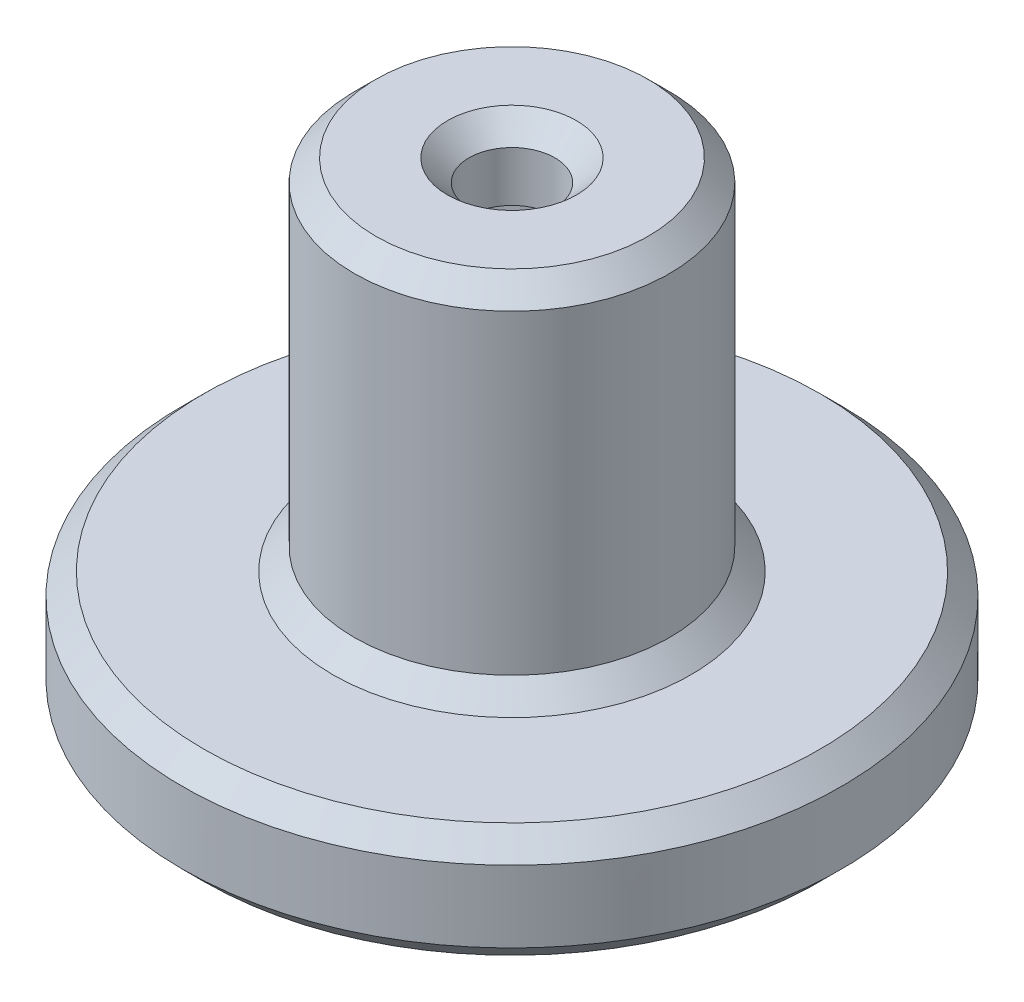
ISO-10303-21;
HEADER;
FILE_DESCRIPTION(('STEP AP214'),'2;1');
FILE_NAME('part.step','',(''),(''),'','','');
FILE_SCHEMA(('AUTOMOTIVE_DESIGN { 1 0 10303 214 1 1 1 1 }'));
ENDSEC;
DATA;
#1=APPLICATION_CONTEXT('core data for automotive mechanical design processes');
#2=APPLICATION_PROTOCOL_DEFINITION('international standard','automotive_design',2000,#1);
#3=PRODUCT_CONTEXT('',#1,'mechanical');
#4=PRODUCT('Part','Part','',(#3));
#5=PRODUCT_RELATED_PRODUCT_CATEGORY('part','',(#4));
#6=PRODUCT_DEFINITION_FORMATION('','',#4);
#7=PRODUCT_DEFINITION_CONTEXT('part definition',#1,'design');
#8=PRODUCT_DEFINITION('design','',#6,#7);
#9=PRODUCT_DEFINITION_SHAPE('','',#8);
#10=(LENGTH_UNIT() NAMED_UNIT(*) SI_UNIT(.MILLI.,.METRE.));
#11=(NAMED_UNIT(*) PLANE_ANGLE_UNIT() SI_UNIT($,.RADIAN.));
#12=(NAMED_UNIT(*) SI_UNIT($,.STERADIAN.) SOLID_ANGLE_UNIT());
#13=UNCERTAINTY_MEASURE_WITH_UNIT(LENGTH_MEASURE(1.E-05),#10,'distance_accuracy_value','');
#14=(GEOMETRIC_REPRESENTATION_CONTEXT(3) GLOBAL_UNCERTAINTY_ASSIGNED_CONTEXT((#13)) GLOBAL_UNIT_ASSIGNED_CONTEXT((#10,
#11,#12)) REPRESENTATION_CONTEXT('',''));
#15=CARTESIAN_POINT('',(0.,0.,0.));
#16=DIRECTION('',(0.,0.,1.));
#17=DIRECTION('',(1.,0.,0.));
#18=AXIS2_PLACEMENT_3D('',#15,#16,#17);
#19=CARTESIAN_POINT('',(0.,8.,0.));
#20=DIRECTION('',(0.,1.,0.));
#21=DIRECTION('',(0.,0.,1.));
#22=AXIS2_PLACEMENT_3D('',#19,#20,#21);
#23=PLANE('',#22);
#24=CARTESIAN_POINT('',(0.,8.,3.95));
#25=DIRECTION('',(0.,1.,0.));
#26=DIRECTION('',(0.,0.,1.));
#27=AXIS2_PLACEMENT_3D('',#24,#25,#26);
#28=CIRCLE('',#27,21.5);
#29=CARTESIAN_POINT('',(0.,8.,-17.55));
#30=VERTEX_POINT('',#29);
#31=EDGE_CURVE('E348',#30,#30,#28,.T.);
#32=ORIENTED_EDGE('',*,*,#31,.T.);
#33=EDGE_LOOP('',(#32));
#34=FACE_BOUND('',#33,.T.);
#35=CARTESIAN_POINT('',(0.,8.,3.95));
#36=DIRECTION('',(0.,1.,0.));
#37=DIRECTION('',(0.,0.,1.));
#38=AXIS2_PLACEMENT_3D('',#35,#36,#37);
#39=CIRCLE('',#38,12.5);
#40=CARTESIAN_POINT('',(0.,8.,16.45));
#41=VERTEX_POINT('',#40);
#42=EDGE_CURVE('E345',#41,#41,#39,.F.);
#43=ORIENTED_EDGE('',*,*,#42,.T.);
#44=EDGE_LOOP('',(#43));
#45=FACE_BOUND('',#44,.T.);
#46=ADVANCED_FACE('F62',(#34,#45),#23,.T.);
#47=CARTESIAN_POINT('',(1.11459982752573,8.,-1.93054353138208));
#48=DIRECTION('',(-0.5,0.,0.866025403784439));
#49=DIRECTION('',(0.866025403784439,0.,0.5));
#50=AXIS2_PLACEMENT_3D('',#47,#48,#49);
#51=PLANE('',#50);
#52=DIRECTION('',(0.,-1.,0.));
#53=VECTOR('',#52,1.);
#54=CARTESIAN_POINT('',(0.,8.,-2.57405804184277));
#55=LINE('',#54,#53);
#56=CARTESIAN_POINT('',(0.,28.,-2.57405804184277));
#57=VERTEX_POINT('',#56);
#58=CARTESIAN_POINT('',(0.,1.50000000000001,-2.57405804184277));
#59=VERTEX_POINT('',#58);
#60=EDGE_CURVE('E265',#57,#59,#55,.T.);
#61=ORIENTED_EDGE('',*,*,#60,.T.);
#62=DIRECTION('',(0.866025403784439,0.,0.5));
#63=VECTOR('',#62,1.);
#64=CARTESIAN_POINT('',(5.65,1.50000000000001,0.687970979078613));
#65=LINE('',#64,#63);
#66=CARTESIAN_POINT('',(5.65,1.50000000000001,0.687970979078613));
#67=VERTEX_POINT('',#66);
#68=EDGE_CURVE('E337',#59,#67,#65,.T.);
#69=ORIENTED_EDGE('',*,*,#68,.T.);
#70=DIRECTION('',(0.,-1.,0.));
#71=VECTOR('',#70,1.);
#72=CARTESIAN_POINT('',(5.65,8.,0.687970979078613));
#73=LINE('',#72,#71);
#74=CARTESIAN_POINT('',(5.65,28.,0.687970979078614));
#75=VERTEX_POINT('',#74);
#76=EDGE_CURVE('E295',#75,#67,#73,.T.);
#77=ORIENTED_EDGE('',*,*,#76,.F.);
#78=DIRECTION('',(0.866025403784439,0.,0.5));
#79=VECTOR('',#78,1.);
#80=CARTESIAN_POINT('',(1.11459982752573,28.,-1.93054353138208));
#81=LINE('',#80,#79);
#82=EDGE_CURVE('E830',#57,#75,#81,.T.);
#83=ORIENTED_EDGE('',*,*,#82,.F.);
#84=EDGE_LOOP('',(#61,#69,#77,#83));
#85=FACE_BOUND('',#84,.T.);
#86=ADVANCED_FACE('F408',(#85),#51,.T.);
#87=CARTESIAN_POINT('',(5.65,8.,0.));
#88=DIRECTION('',(-1.,0.,0.));
#89=DIRECTION('',(0.,0.,1.));
#90=AXIS2_PLACEMENT_3D('',#87,#88,#89);
#91=PLANE('',#90);
#92=DIRECTION('',(0.,-1.,0.));
#93=VECTOR('',#92,1.);
#94=CARTESIAN_POINT('',(5.65,3.5,5.2));
#95=LINE('',#94,#93);
#96=CARTESIAN_POINT('',(5.65,3.5,5.2));
#97=VERTEX_POINT('',#96);
#98=CARTESIAN_POINT('',(5.65,1.50000000000001,5.2));
#99=VERTEX_POINT('',#98);
#100=EDGE_CURVE('E276',#97,#99,#95,.T.);
#101=ORIENTED_EDGE('',*,*,#100,.T.);
#102=DIRECTION('',(0.,0.,1.));
#103=VECTOR('',#102,1.);
#104=CARTESIAN_POINT('',(5.65,1.50000000000001,7.21202902092138));
#105=LINE('',#104,#103);
#106=CARTESIAN_POINT('',(5.65,1.50000000000001,7.21202902092138));
#107=VERTEX_POINT('',#106);
#108=EDGE_CURVE('E330',#99,#107,#105,.T.);
#109=ORIENTED_EDGE('',*,*,#108,.T.);
#110=DIRECTION('',(0.,-1.,0.));
#111=VECTOR('',#110,1.);
#112=CARTESIAN_POINT('',(5.65,8.,7.21202902092138));
#113=LINE('',#112,#111);
#114=CARTESIAN_POINT('',(5.65,28.,7.21202902092138));
#115=VERTEX_POINT('',#114);
#116=EDGE_CURVE('E292',#115,#107,#113,.T.);
#117=ORIENTED_EDGE('',*,*,#116,.F.);
#118=DIRECTION('',(0.,0.,1.));
#119=VECTOR('',#118,1.);
#120=CARTESIAN_POINT('',(5.65,28.,0.));
#121=LINE('',#120,#119);
#122=EDGE_CURVE('E230',#75,#115,#121,.T.);
#123=ORIENTED_EDGE('',*,*,#122,.F.);
#124=ORIENTED_EDGE('',*,*,#76,.T.);
#125=DIRECTION('',(0.,0.,1.));
#126=VECTOR('',#125,1.);
#127=CARTESIAN_POINT('',(5.65,1.50000000000001,2.7));
#128=LINE('',#127,#126);
#129=CARTESIAN_POINT('',(5.65,1.50000000000001,2.7));
#130=VERTEX_POINT('',#129);
#131=EDGE_CURVE('E87',#67,#130,#128,.T.);
#132=ORIENTED_EDGE('',*,*,#131,.T.);
#133=DIRECTION('',(0.,-1.,0.));
#134=VECTOR('',#133,1.);
#135=CARTESIAN_POINT('',(5.65,3.5,2.7));
#136=LINE('',#135,#134);
#137=CARTESIAN_POINT('',(5.65,3.5,2.7));
#138=VERTEX_POINT('',#137);
#139=EDGE_CURVE('E284',#138,#130,#136,.T.);
#140=ORIENTED_EDGE('',*,*,#139,.F.);
#141=DIRECTION('',(0.,0.,-1.));
#142=VECTOR('',#141,1.);
#143=CARTESIAN_POINT('',(5.65,3.5,0.));
#144=LINE('',#143,#142);
#145=EDGE_CURVE('E274',#97,#138,#144,.T.);
#146=ORIENTED_EDGE('',*,*,#145,.F.);
#147=EDGE_LOOP('',(#101,#109,#117,#123,#124,#132,#140,#146));
#148=FACE_BOUND('',#147,.T.);
#149=ADVANCED_FACE('F404',(#148),#91,.T.);
#150=CARTESIAN_POINT('',(4.53540017247427,8.,7.85554353138208));
#151=DIRECTION('',(-0.5,0.,-0.866025403784438));
#152=DIRECTION('',(-0.866025403784438,0.,0.5));
#153=AXIS2_PLACEMENT_3D('',#150,#151,#152);
#154=PLANE('',#153);
#155=ORIENTED_EDGE('',*,*,#116,.T.);
#156=DIRECTION('',(-0.866025403784438,0.,0.5));
#157=VECTOR('',#156,1.);
#158=CARTESIAN_POINT('',(0.,1.50000000000001,10.4740580418428));
#159=LINE('',#158,#157);
#160=CARTESIAN_POINT('',(0.,1.50000000000001,10.4740580418428));
#161=VERTEX_POINT('',#160);
#162=EDGE_CURVE('E325',#107,#161,#159,.T.);
#163=ORIENTED_EDGE('',*,*,#162,.T.);
#164=DIRECTION('',(0.,-1.,0.));
#165=VECTOR('',#164,1.);
#166=CARTESIAN_POINT('',(0.,8.,10.4740580418428));
#167=LINE('',#166,#165);
#168=CARTESIAN_POINT('',(0.,28.,10.4740580418428));
#169=VERTEX_POINT('',#168);
#170=EDGE_CURVE('E219',#169,#161,#167,.T.);
#171=ORIENTED_EDGE('',*,*,#170,.F.);
#172=DIRECTION('',(-0.866025403784439,0.,0.5));
#173=VECTOR('',#172,1.);
#174=CARTESIAN_POINT('',(4.53540017247427,28.,7.85554353138208));
#175=LINE('',#174,#173);
#176=EDGE_CURVE('E224',#115,#169,#175,.T.);
#177=ORIENTED_EDGE('',*,*,#176,.F.);
#178=EDGE_LOOP('',(#155,#163,#171,#177));
#179=FACE_BOUND('',#178,.T.);
#180=ADVANCED_FACE('F407',(#179),#154,.T.);
#181=CARTESIAN_POINT('',(-4.53540017247426,8.,7.85554353138208));
#182=DIRECTION('',(0.5,0.,-0.866025403784439));
#183=DIRECTION('',(-0.866025403784439,0.,-0.5));
#184=AXIS2_PLACEMENT_3D('',#181,#182,#183);
#185=PLANE('',#184);
#186=ORIENTED_EDGE('',*,*,#170,.T.);
#187=DIRECTION('',(-0.866025403784439,0.,-0.5));
#188=VECTOR('',#187,1.);
#189=CARTESIAN_POINT('',(-5.65,1.50000000000001,7.21202902092138));
#190=LINE('',#189,#188);
#191=CARTESIAN_POINT('',(-5.65,1.50000000000001,7.21202902092138));
#192=VERTEX_POINT('',#191);
#193=EDGE_CURVE('E218',#161,#192,#190,.T.);
#194=ORIENTED_EDGE('',*,*,#193,.T.);
#195=DIRECTION('',(0.,-1.,0.));
#196=VECTOR('',#195,1.);
#197=CARTESIAN_POINT('',(-5.65,8.,7.21202902092138));
#198=LINE('',#197,#196);
#199=CARTESIAN_POINT('',(-5.65,28.,7.21202902092138));
#200=VERTEX_POINT('',#199);
#201=EDGE_CURVE('E201',#200,#192,#198,.T.);
#202=ORIENTED_EDGE('',*,*,#201,.F.);
#203=DIRECTION('',(-0.866025403784439,0.,-0.5));
#204=VECTOR('',#203,1.);
#205=CARTESIAN_POINT('',(-4.53540017247427,28.,7.85554353138208));
#206=LINE('',#205,#204);
#207=EDGE_CURVE('E215',#169,#200,#206,.T.);
#208=ORIENTED_EDGE('',*,*,#207,.F.);
#209=EDGE_LOOP('',(#186,#194,#202,#208));
#210=FACE_BOUND('',#209,.T.);
#211=ADVANCED_FACE('F214',(#210),#185,.T.);
#212=CARTESIAN_POINT('',(-5.65,8.,0.));
#213=DIRECTION('',(1.,0.,0.));
#214=DIRECTION('',(0.,0.,-1.));
#215=AXIS2_PLACEMENT_3D('',#212,#213,#214);
#216=PLANE('',#215);
#217=ORIENTED_EDGE('',*,*,#201,.T.);
#218=DIRECTION('',(0.,0.,-1.));
#219=VECTOR('',#218,1.);
#220=CARTESIAN_POINT('',(-5.65,1.50000000000001,5.2));
#221=LINE('',#220,#219);
#222=CARTESIAN_POINT('',(-5.65,1.50000000000001,5.2));
#223=VERTEX_POINT('',#222);
#224=EDGE_CURVE('E320',#192,#223,#221,.T.);
#225=ORIENTED_EDGE('',*,*,#224,.T.);
#226=DIRECTION('',(0.,-1.,0.));
#227=VECTOR('',#226,1.);
#228=CARTESIAN_POINT('',(-5.65,3.5,5.2));
#229=LINE('',#228,#227);
#230=CARTESIAN_POINT('',(-5.65,3.5,5.2));
#231=VERTEX_POINT('',#230);
#232=EDGE_CURVE('E262',#231,#223,#229,.T.);
#233=ORIENTED_EDGE('',*,*,#232,.F.);
#234=DIRECTION('',(0.,0.,1.));
#235=VECTOR('',#234,1.);
#236=CARTESIAN_POINT('',(-5.65,3.5,0.));
#237=LINE('',#236,#235);
#238=CARTESIAN_POINT('',(-5.65,3.5,2.7));
#239=VERTEX_POINT('',#238);
#240=EDGE_CURVE('E237',#239,#231,#237,.T.);
#241=ORIENTED_EDGE('',*,*,#240,.F.);
#242=DIRECTION('',(0.,-1.,0.));
#243=VECTOR('',#242,1.);
#244=CARTESIAN_POINT('',(-5.65,3.5,2.7));
#245=LINE('',#244,#243);
#246=CARTESIAN_POINT('',(-5.65,1.50000000000001,2.7));
#247=VERTEX_POINT('',#246);
#248=EDGE_CURVE('E259',#239,#247,#245,.T.);
#249=ORIENTED_EDGE('',*,*,#248,.T.);
#250=DIRECTION('',(0.,0.,-1.));
#251=VECTOR('',#250,1.);
#252=CARTESIAN_POINT('',(-5.65,1.50000000000001,0.687970979078614));
#253=LINE('',#252,#251);
#254=CARTESIAN_POINT('',(-5.65,1.50000000000001,0.687970979078614));
#255=VERTEX_POINT('',#254);
#256=EDGE_CURVE('E318',#247,#255,#253,.T.);
#257=ORIENTED_EDGE('',*,*,#256,.T.);
#258=DIRECTION('',(0.,-1.,0.));
#259=VECTOR('',#258,1.);
#260=CARTESIAN_POINT('',(-5.65,8.,0.687970979078614));
#261=LINE('',#260,#259);
#262=CARTESIAN_POINT('',(-5.65,28.,0.687970979078615));
#263=VERTEX_POINT('',#262);
#264=EDGE_CURVE('E203',#263,#255,#261,.T.);
#265=ORIENTED_EDGE('',*,*,#264,.F.);
#266=DIRECTION('',(0.,0.,-1.));
#267=VECTOR('',#266,1.);
#268=CARTESIAN_POINT('',(-5.65,28.,0.));
#269=LINE('',#268,#267);
#270=EDGE_CURVE('E198',#200,#263,#269,.T.);
#271=ORIENTED_EDGE('',*,*,#270,.F.);
#272=EDGE_LOOP('',(#217,#225,#233,#241,#249,#257,#265,#271));
#273=FACE_BOUND('',#272,.T.);
#274=ADVANCED_FACE('F200',(#273),#216,.T.);
#275=CARTESIAN_POINT('',(-1.11459982752573,8.,-1.93054353138208));
#276=DIRECTION('',(0.5,0.,0.866025403784439));
#277=DIRECTION('',(0.866025403784439,0.,-0.5));
#278=AXIS2_PLACEMENT_3D('',#275,#276,#277);
#279=PLANE('',#278);
#280=ORIENTED_EDGE('',*,*,#264,.T.);
#281=DIRECTION('',(0.866025403784439,0.,-0.5));
#282=VECTOR('',#281,1.);
#283=CARTESIAN_POINT('',(0.,1.50000000000001,-2.57405804184277));
#284=LINE('',#283,#282);
#285=EDGE_CURVE('E79',#255,#59,#284,.T.);
#286=ORIENTED_EDGE('',*,*,#285,.T.);
#287=ORIENTED_EDGE('',*,*,#60,.F.);
#288=DIRECTION('',(0.866025403784439,0.,-0.5));
#289=VECTOR('',#288,1.);
#290=CARTESIAN_POINT('',(-1.11459982752573,28.,-1.93054353138208));
#291=LINE('',#290,#289);
#292=EDGE_CURVE('E208',#263,#57,#291,.T.);
#293=ORIENTED_EDGE('',*,*,#292,.F.);
#294=EDGE_LOOP('',(#280,#286,#287,#293));
#295=FACE_BOUND('',#294,.T.);
#296=ADVANCED_FACE('F434',(#295),#279,.T.);
#297=CARTESIAN_POINT('',(0.,8.,3.95));
#298=DIRECTION('',(0.,-1.,0.));
#299=DIRECTION('',(0.,0.,-1.));
#300=AXIS2_PLACEMENT_3D('',#297,#298,#299);
#301=CYLINDRICAL_SURFACE('',#300,23.);
#302=CARTESIAN_POINT('',(0.,1.5,3.95));
#303=DIRECTION('',(0.,1.,0.));
#304=DIRECTION('',(0.,0.,1.));
#305=AXIS2_PLACEMENT_3D('',#302,#303,#304);
#306=CIRCLE('',#305,23.);
#307=CARTESIAN_POINT('',(0.,1.5,26.95));
#308=VERTEX_POINT('',#307);
#309=EDGE_CURVE('E342',#308,#308,#306,.T.);
#310=ORIENTED_EDGE('',*,*,#309,.T.);
#311=EDGE_LOOP('',(#310));
#312=FACE_BOUND('',#311,.T.);
#313=CARTESIAN_POINT('',(0.,6.49999999999999,3.95));
#314=DIRECTION('',(0.,1.,0.));
#315=DIRECTION('',(0.,0.,1.));
#316=AXIS2_PLACEMENT_3D('',#313,#314,#315);
#317=CIRCLE('',#316,23.);
#318=CARTESIAN_POINT('',(0.,6.49999999999999,-19.05));
#319=VERTEX_POINT('',#318);
#320=EDGE_CURVE('E339',#319,#319,#317,.F.);
#321=ORIENTED_EDGE('',*,*,#320,.T.);
#322=EDGE_LOOP('',(#321));
#323=FACE_BOUND('',#322,.T.);
#324=ADVANCED_FACE('F430',(#312,#323),#301,.T.);
#325=CARTESIAN_POINT('',(0.,0.,0.));
#326=DIRECTION('',(0.,1.,0.));
#327=DIRECTION('',(0.,0.,1.));
#328=AXIS2_PLACEMENT_3D('',#325,#326,#327);
#329=PLANE('',#328);
#330=CARTESIAN_POINT('',(0.,0.,3.95));
#331=DIRECTION('',(0.,1.,0.));
#332=DIRECTION('',(0.,0.,1.));
#333=AXIS2_PLACEMENT_3D('',#330,#331,#332);
#334=CIRCLE('',#333,21.5);
#335=CARTESIAN_POINT('',(0.,0.,25.45));
#336=VERTEX_POINT('',#335);
#337=EDGE_CURVE('E297',#336,#336,#334,.F.);
#338=ORIENTED_EDGE('',*,*,#337,.T.);
#339=EDGE_LOOP('',(#338));
#340=FACE_BOUND('',#339,.T.);
#341=DIRECTION('',(-1.,0.,0.));
#342=VECTOR('',#341,1.);
#343=CARTESIAN_POINT('',(0.,0.,5.2));
#344=LINE('',#343,#342);
#345=CARTESIAN_POINT('',(-7.15,0.,5.2));
#346=VERTEX_POINT('',#345);
#347=CARTESIAN_POINT('',(-17.5,0.,5.2));
#348=VERTEX_POINT('',#347);
#349=EDGE_CURVE('E247',#346,#348,#344,.T.);
#350=ORIENTED_EDGE('',*,*,#349,.F.);
#351=DIRECTION('',(0.,0.,1.));
#352=VECTOR('',#351,1.);
#353=CARTESIAN_POINT('',(-7.15,0.,7.21202902092138));
#354=LINE('',#353,#352);
#355=CARTESIAN_POINT('',(-7.15,0.,8.07805442470582));
#356=VERTEX_POINT('',#355);
#357=EDGE_CURVE('E315',#346,#356,#354,.T.);
#358=ORIENTED_EDGE('',*,*,#357,.T.);
#359=DIRECTION('',(0.866025403784439,0.,0.5));
#360=VECTOR('',#359,1.);
#361=CARTESIAN_POINT('',(-0.749999999999998,0.,11.7730961475194));
#362=LINE('',#361,#360);
#363=CARTESIAN_POINT('',(0.,0.,12.2061088494117));
#364=VERTEX_POINT('',#363);
#365=EDGE_CURVE('E313',#356,#364,#362,.T.);
#366=ORIENTED_EDGE('',*,*,#365,.T.);
#367=DIRECTION('',(0.866025403784439,0.,-0.5));
#368=VECTOR('',#367,1.);
#369=CARTESIAN_POINT('',(6.4,0.,8.51106712659804));
#370=LINE('',#369,#368);
#371=CARTESIAN_POINT('',(7.15,0.,8.07805442470582));
#372=VERTEX_POINT('',#371);
#373=EDGE_CURVE('E311',#364,#372,#370,.T.);
#374=ORIENTED_EDGE('',*,*,#373,.T.);
#375=DIRECTION('',(0.,0.,-1.));
#376=VECTOR('',#375,1.);
#377=CARTESIAN_POINT('',(7.15,0.,5.2));
#378=LINE('',#377,#376);
#379=CARTESIAN_POINT('',(7.15,0.,5.2));
#380=VERTEX_POINT('',#379);
#381=EDGE_CURVE('E309',#372,#380,#378,.T.);
#382=ORIENTED_EDGE('',*,*,#381,.T.);
#383=DIRECTION('',(-1.,0.,0.));
#384=VECTOR('',#383,1.);
#385=CARTESIAN_POINT('',(0.,0.,5.2));
#386=LINE('',#385,#384);
#387=CARTESIAN_POINT('',(17.5,0.,5.2));
#388=VERTEX_POINT('',#387);
#389=EDGE_CURVE('E225',#388,#380,#386,.T.);
#390=ORIENTED_EDGE('',*,*,#389,.F.);
#391=DIRECTION('',(0.,0.,-1.));
#392=VECTOR('',#391,1.);
#393=CARTESIAN_POINT('',(17.5,0.,0.));
#394=LINE('',#393,#392);
#395=CARTESIAN_POINT('',(17.5,0.,2.7));
#396=VERTEX_POINT('',#395);
#397=EDGE_CURVE('E228',#388,#396,#394,.T.);
#398=ORIENTED_EDGE('',*,*,#397,.T.);
#399=DIRECTION('',(-1.,0.,0.));
#400=VECTOR('',#399,1.);
#401=CARTESIAN_POINT('',(0.,0.,2.7));
#402=LINE('',#401,#400);
#403=CARTESIAN_POINT('',(7.15,0.,2.7));
#404=VERTEX_POINT('',#403);
#405=EDGE_CURVE('E270',#396,#404,#402,.T.);
#406=ORIENTED_EDGE('',*,*,#405,.T.);
#407=DIRECTION('',(0.,0.,-1.));
#408=VECTOR('',#407,1.);
#409=CARTESIAN_POINT('',(7.15,0.,0.687970979078613));
#410=LINE('',#409,#408);
#411=CARTESIAN_POINT('',(7.15,0.,-0.178054424705827));
#412=VERTEX_POINT('',#411);
#413=EDGE_CURVE('E304',#404,#412,#410,.T.);
#414=ORIENTED_EDGE('',*,*,#413,.T.);
#415=DIRECTION('',(-0.866025403784439,0.,-0.5));
#416=VECTOR('',#415,1.);
#417=CARTESIAN_POINT('',(0.75,0.,-3.87309614751943));
#418=LINE('',#417,#416);
#419=CARTESIAN_POINT('',(0.,0.,-4.30610884941165));
#420=VERTEX_POINT('',#419);
#421=EDGE_CURVE('E300',#412,#420,#418,.T.);
#422=ORIENTED_EDGE('',*,*,#421,.T.);
#423=DIRECTION('',(-0.866025403784439,0.,0.5));
#424=VECTOR('',#423,1.);
#425=CARTESIAN_POINT('',(-6.4,0.,-0.611067126598043));
#426=LINE('',#425,#424);
#427=CARTESIAN_POINT('',(-7.15,0.,-0.178054424705824));
#428=VERTEX_POINT('',#427);
#429=EDGE_CURVE('E302',#420,#428,#426,.T.);
#430=ORIENTED_EDGE('',*,*,#429,.T.);
#431=DIRECTION('',(0.,0.,1.));
#432=VECTOR('',#431,1.);
#433=CARTESIAN_POINT('',(-7.15,0.,2.7));
#434=LINE('',#433,#432);
#435=CARTESIAN_POINT('',(-7.15,0.,2.7));
#436=VERTEX_POINT('',#435);
#437=EDGE_CURVE('E306',#428,#436,#434,.T.);
#438=ORIENTED_EDGE('',*,*,#437,.T.);
#439=DIRECTION('',(-1.,0.,0.));
#440=VECTOR('',#439,1.);
#441=CARTESIAN_POINT('',(0.,0.,2.7));
#442=LINE('',#441,#440);
#443=CARTESIAN_POINT('',(-17.5,0.,2.7));
#444=VERTEX_POINT('',#443);
#445=EDGE_CURVE('E249',#436,#444,#442,.T.);
#446=ORIENTED_EDGE('',*,*,#445,.T.);
#447=DIRECTION('',(0.,0.,-1.));
#448=VECTOR('',#447,1.);
#449=CARTESIAN_POINT('',(-17.5,0.,0.));
#450=LINE('',#449,#448);
#451=EDGE_CURVE('E238',#348,#444,#450,.T.);
#452=ORIENTED_EDGE('',*,*,#451,.F.);
#453=EDGE_LOOP('',(#350,#358,#366,#374,#382,#390,#398,#406,#414,#422,#430,#438,#446,#452));
#454=FACE_BOUND('',#453,.T.);
#455=ADVANCED_FACE('F393',(#340,#454),#329,.F.);
#456=CARTESIAN_POINT('',(0.,3.5,5.2));
#457=DIRECTION('',(0.,0.,1.));
#458=DIRECTION('',(1.,0.,0.));
#459=AXIS2_PLACEMENT_3D('',#456,#457,#458);
#460=PLANE('',#459);
#461=ORIENTED_EDGE('',*,*,#389,.T.);
#462=DIRECTION('',(-0.707106781186546,0.707106781186549,0.));
#463=VECTOR('',#462,1.);
#464=CARTESIAN_POINT('',(7.15,0.,5.2));
#465=LINE('',#464,#463);
#466=EDGE_CURVE('E327',#380,#99,#465,.T.);
#467=ORIENTED_EDGE('',*,*,#466,.T.);
#468=ORIENTED_EDGE('',*,*,#100,.F.);
#469=DIRECTION('',(-1.,0.,0.));
#470=VECTOR('',#469,1.);
#471=CARTESIAN_POINT('',(0.,3.5,5.2));
#472=LINE('',#471,#470);
#473=CARTESIAN_POINT('',(17.5,3.5,5.2));
#474=VERTEX_POINT('',#473);
#475=EDGE_CURVE('E266',#474,#97,#472,.T.);
#476=ORIENTED_EDGE('',*,*,#475,.F.);
#477=DIRECTION('',(0.,-1.,0.));
#478=VECTOR('',#477,1.);
#479=CARTESIAN_POINT('',(17.5,3.5,5.2));
#480=LINE('',#479,#478);
#481=EDGE_CURVE('E250',#474,#388,#480,.T.);
#482=ORIENTED_EDGE('',*,*,#481,.T.);
#483=EDGE_LOOP('',(#461,#467,#468,#476,#482));
#484=FACE_BOUND('',#483,.T.);
#485=ADVANCED_FACE('F426',(#484),#460,.F.);
#486=CARTESIAN_POINT('',(17.5,3.5,0.));
#487=DIRECTION('',(-1.,0.,0.));
#488=DIRECTION('',(0.,0.,1.));
#489=AXIS2_PLACEMENT_3D('',#486,#487,#488);
#490=PLANE('',#489);
#491=ORIENTED_EDGE('',*,*,#397,.F.);
#492=ORIENTED_EDGE('',*,*,#481,.F.);
#493=DIRECTION('',(0.,0.,-1.));
#494=VECTOR('',#493,1.);
#495=CARTESIAN_POINT('',(17.5,3.5,0.));
#496=LINE('',#495,#494);
#497=CARTESIAN_POINT('',(17.5,3.5,2.7));
#498=VERTEX_POINT('',#497);
#499=EDGE_CURVE('E269',#474,#498,#496,.T.);
#500=ORIENTED_EDGE('',*,*,#499,.T.);
#501=DIRECTION('',(0.,-1.,0.));
#502=VECTOR('',#501,1.);
#503=CARTESIAN_POINT('',(17.5,3.5,2.7));
#504=LINE('',#503,#502);
#505=EDGE_CURVE('E286',#498,#396,#504,.T.);
#506=ORIENTED_EDGE('',*,*,#505,.T.);
#507=EDGE_LOOP('',(#491,#492,#500,#506));
#508=FACE_BOUND('',#507,.T.);
#509=ADVANCED_FACE('F397',(#508),#490,.T.);
#510=CARTESIAN_POINT('',(0.,3.5,2.7));
#511=DIRECTION('',(0.,0.,1.));
#512=DIRECTION('',(1.,0.,0.));
#513=AXIS2_PLACEMENT_3D('',#510,#511,#512);
#514=PLANE('',#513);
#515=ORIENTED_EDGE('',*,*,#139,.T.);
#516=DIRECTION('',(0.707106781186545,-0.70710678118655,0.));
#517=VECTOR('',#516,1.);
#518=CARTESIAN_POINT('',(1.82500000000002,5.32500000000001,2.7));
#519=LINE('',#518,#517);
#520=EDGE_CURVE('E334',#130,#404,#519,.T.);
#521=ORIENTED_EDGE('',*,*,#520,.T.);
#522=ORIENTED_EDGE('',*,*,#405,.F.);
#523=ORIENTED_EDGE('',*,*,#505,.F.);
#524=DIRECTION('',(-1.,0.,0.));
#525=VECTOR('',#524,1.);
#526=CARTESIAN_POINT('',(0.,3.5,2.7));
#527=LINE('',#526,#525);
#528=EDGE_CURVE('E272',#498,#138,#527,.T.);
#529=ORIENTED_EDGE('',*,*,#528,.T.);
#530=EDGE_LOOP('',(#515,#521,#522,#523,#529));
#531=FACE_BOUND('',#530,.T.);
#532=ADVANCED_FACE('F389',(#531),#514,.T.);
#533=CARTESIAN_POINT('',(0.,3.5,0.));
#534=DIRECTION('',(0.,1.,0.));
#535=DIRECTION('',(0.,0.,1.));
#536=AXIS2_PLACEMENT_3D('',#533,#534,#535);
#537=PLANE('',#536);
#538=ORIENTED_EDGE('',*,*,#475,.T.);
#539=ORIENTED_EDGE('',*,*,#145,.T.);
#540=ORIENTED_EDGE('',*,*,#528,.F.);
#541=ORIENTED_EDGE('',*,*,#499,.F.);
#542=EDGE_LOOP('',(#538,#539,#540,#541));
#543=FACE_BOUND('',#542,.T.);
#544=ADVANCED_FACE('F401',(#543),#537,.F.);
#545=CARTESIAN_POINT('',(0.,3.5,5.2));
#546=DIRECTION('',(0.,0.,1.));
#547=DIRECTION('',(1.,0.,0.));
#548=AXIS2_PLACEMENT_3D('',#545,#546,#547);
#549=PLANE('',#548);
#550=ORIENTED_EDGE('',*,*,#232,.T.);
#551=DIRECTION('',(-0.707106781186546,-0.707106781186549,0.));
#552=VECTOR('',#551,1.);
#553=CARTESIAN_POINT('',(-7.15,0.,5.2));
#554=LINE('',#553,#552);
#555=EDGE_CURVE('E322',#223,#346,#554,.T.);
#556=ORIENTED_EDGE('',*,*,#555,.T.);
#557=ORIENTED_EDGE('',*,*,#349,.T.);
#558=DIRECTION('',(0.,-1.,0.));
#559=VECTOR('',#558,1.);
#560=CARTESIAN_POINT('',(-17.5,3.5,5.2));
#561=LINE('',#560,#559);
#562=CARTESIAN_POINT('',(-17.5,3.5,5.2));
#563=VERTEX_POINT('',#562);
#564=EDGE_CURVE('E246',#563,#348,#561,.T.);
#565=ORIENTED_EDGE('',*,*,#564,.F.);
#566=DIRECTION('',(-1.,0.,0.));
#567=VECTOR('',#566,1.);
#568=CARTESIAN_POINT('',(0.,3.5,5.2));
#569=LINE('',#568,#567);
#570=EDGE_CURVE('E234',#231,#563,#569,.T.);
#571=ORIENTED_EDGE('',*,*,#570,.F.);
#572=EDGE_LOOP('',(#550,#556,#557,#565,#571));
#573=FACE_BOUND('',#572,.T.);
#574=ADVANCED_FACE('F485',(#573),#549,.F.);
#575=CARTESIAN_POINT('',(0.,3.5,2.7));
#576=DIRECTION('',(0.,0.,1.));
#577=DIRECTION('',(1.,0.,0.));
#578=AXIS2_PLACEMENT_3D('',#575,#576,#577);
#579=PLANE('',#578);
#580=ORIENTED_EDGE('',*,*,#445,.F.);
#581=DIRECTION('',(0.707106781186545,0.70710678118655,0.));
#582=VECTOR('',#581,1.);
#583=CARTESIAN_POINT('',(-1.82500000000002,5.32500000000001,2.7));
#584=LINE('',#583,#582);
#585=EDGE_CURVE('E332',#436,#247,#584,.T.);
#586=ORIENTED_EDGE('',*,*,#585,.T.);
#587=ORIENTED_EDGE('',*,*,#248,.F.);
#588=DIRECTION('',(-1.,0.,0.));
#589=VECTOR('',#588,1.);
#590=CARTESIAN_POINT('',(0.,3.5,2.7));
#591=LINE('',#590,#589);
#592=CARTESIAN_POINT('',(-17.5,3.5,2.7));
#593=VERTEX_POINT('',#592);
#594=EDGE_CURVE('E241',#239,#593,#591,.T.);
#595=ORIENTED_EDGE('',*,*,#594,.T.);
#596=DIRECTION('',(0.,-1.,0.));
#597=VECTOR('',#596,1.);
#598=CARTESIAN_POINT('',(-17.5,3.5,2.7));
#599=LINE('',#598,#597);
#600=EDGE_CURVE('E256',#593,#444,#599,.T.);
#601=ORIENTED_EDGE('',*,*,#600,.T.);
#602=EDGE_LOOP('',(#580,#586,#587,#595,#601));
#603=FACE_BOUND('',#602,.T.);
#604=ADVANCED_FACE('F492',(#603),#579,.T.);
#605=CARTESIAN_POINT('',(-17.5,3.5,0.));
#606=DIRECTION('',(-1.,0.,0.));
#607=DIRECTION('',(0.,0.,1.));
#608=AXIS2_PLACEMENT_3D('',#605,#606,#607);
#609=PLANE('',#608);
#610=ORIENTED_EDGE('',*,*,#451,.T.);
#611=ORIENTED_EDGE('',*,*,#600,.F.);
#612=DIRECTION('',(0.,0.,-1.));
#613=VECTOR('',#612,1.);
#614=CARTESIAN_POINT('',(-17.5,3.5,0.));
#615=LINE('',#614,#613);
#616=EDGE_CURVE('E243',#563,#593,#615,.T.);
#617=ORIENTED_EDGE('',*,*,#616,.F.);
#618=ORIENTED_EDGE('',*,*,#564,.T.);
#619=EDGE_LOOP('',(#610,#611,#617,#618));
#620=FACE_BOUND('',#619,.T.);
#621=ADVANCED_FACE('F500',(#620),#609,.F.);
#622=CARTESIAN_POINT('',(0.,3.5,0.));
#623=DIRECTION('',(0.,1.,0.));
#624=DIRECTION('',(0.,0.,1.));
#625=AXIS2_PLACEMENT_3D('',#622,#623,#624);
#626=PLANE('',#625);
#627=ORIENTED_EDGE('',*,*,#570,.T.);
#628=ORIENTED_EDGE('',*,*,#616,.T.);
#629=ORIENTED_EDGE('',*,*,#594,.F.);
#630=ORIENTED_EDGE('',*,*,#240,.T.);
#631=EDGE_LOOP('',(#627,#628,#629,#630));
#632=FACE_BOUND('',#631,.T.);
#633=ADVANCED_FACE('F508',(#632),#626,.F.);
#634=CARTESIAN_POINT('',(0.,28.,3.95));
#635=DIRECTION('',(0.,-1.,0.));
#636=DIRECTION('',(0.,0.,-1.));
#637=AXIS2_PLACEMENT_3D('',#634,#635,#636);
#638=CYLINDRICAL_SURFACE('',#637,11.);
#639=CARTESIAN_POINT('',(0.,9.5,3.95));
#640=DIRECTION('',(0.,1.,0.));
#641=DIRECTION('',(0.,0.,1.));
#642=AXIS2_PLACEMENT_3D('',#639,#640,#641);
#643=CIRCLE('',#642,11.);
#644=CARTESIAN_POINT('',(0.,9.5,14.95));
#645=VERTEX_POINT('',#644);
#646=EDGE_CURVE('E354',#645,#645,#643,.T.);
#647=ORIENTED_EDGE('',*,*,#646,.T.);
#648=EDGE_LOOP('',(#647));
#649=FACE_BOUND('',#648,.T.);
#650=CARTESIAN_POINT('',(0.,31.5,3.95));
#651=DIRECTION('',(0.,1.,0.));
#652=DIRECTION('',(0.,0.,1.));
#653=AXIS2_PLACEMENT_3D('',#650,#651,#652);
#654=CIRCLE('',#653,11.);
#655=CARTESIAN_POINT('',(0.,31.5,14.95));
#656=VERTEX_POINT('',#655);
#657=EDGE_CURVE('E351',#656,#656,#654,.F.);
#658=ORIENTED_EDGE('',*,*,#657,.T.);
#659=EDGE_LOOP('',(#658));
#660=FACE_BOUND('',#659,.T.);
#661=ADVANCED_FACE('F516',(#649,#660),#638,.T.);
#662=CARTESIAN_POINT('',(0.,28.,3.95));
#663=DIRECTION('',(0.,1.,0.));
#664=DIRECTION('',(0.,0.,1.));
#665=AXIS2_PLACEMENT_3D('',#662,#663,#664);
#666=PLANE('',#665);
#667=CARTESIAN_POINT('',(0.,28.,3.95));
#668=DIRECTION('',(0.,1.,0.));
#669=DIRECTION('',(0.,0.,1.));
#670=AXIS2_PLACEMENT_3D('',#667,#668,#669);
#671=CIRCLE('',#670,3.);
#672=CARTESIAN_POINT('',(0.,28.,6.95));
#673=VERTEX_POINT('',#672);
#674=EDGE_CURVE('E209',#673,#673,#671,.T.);
#675=ORIENTED_EDGE('',*,*,#674,.T.);
#676=EDGE_LOOP('',(#675));
#677=FACE_BOUND('',#676,.T.);
#678=ORIENTED_EDGE('',*,*,#207,.T.);
#679=ORIENTED_EDGE('',*,*,#270,.T.);
#680=ORIENTED_EDGE('',*,*,#292,.T.);
#681=ORIENTED_EDGE('',*,*,#82,.T.);
#682=ORIENTED_EDGE('',*,*,#122,.T.);
#683=ORIENTED_EDGE('',*,*,#176,.T.);
#684=EDGE_LOOP('',(#678,#679,#680,#681,#682,#683));
#685=FACE_BOUND('',#684,.T.);
#686=ADVANCED_FACE('F221',(#677,#685),#666,.F.);
#687=CARTESIAN_POINT('',(0.,33.,3.95));
#688=DIRECTION('',(0.,1.,0.));
#689=DIRECTION('',(0.,0.,1.));
#690=AXIS2_PLACEMENT_3D('',#687,#688,#689);
#691=PLANE('',#690);
#692=CARTESIAN_POINT('',(0.,33.,3.95));
#693=DIRECTION('',(0.,1.,0.));
#694=DIRECTION('',(0.,0.,1.));
#695=AXIS2_PLACEMENT_3D('',#692,#693,#694);
#696=CIRCLE('',#695,4.5);
#697=CARTESIAN_POINT('',(0.,33.,8.45));
#698=VERTEX_POINT('',#697);
#699=EDGE_CURVE('E12',#698,#698,#696,.F.);
#700=ORIENTED_EDGE('',*,*,#699,.T.);
#701=EDGE_LOOP('',(#700));
#702=FACE_BOUND('',#701,.T.);
#703=CARTESIAN_POINT('',(0.,33.,3.95));
#704=DIRECTION('',(0.,1.,0.));
#705=DIRECTION('',(0.,0.,1.));
#706=AXIS2_PLACEMENT_3D('',#703,#704,#705);
#707=CIRCLE('',#706,9.50000000000002);
#708=CARTESIAN_POINT('',(0.,33.,13.45));
#709=VERTEX_POINT('',#708);
#710=EDGE_CURVE('E71',#709,#709,#707,.T.);
#711=ORIENTED_EDGE('',*,*,#710,.T.);
#712=EDGE_LOOP('',(#711));
#713=FACE_BOUND('',#712,.T.);
#714=ADVANCED_FACE('F531',(#702,#713),#691,.T.);
#715=CARTESIAN_POINT('',(0.,33.,3.95));
#716=DIRECTION('',(0.,-1.,0.));
#717=DIRECTION('',(0.,0.,-1.));
#718=AXIS2_PLACEMENT_3D('',#715,#716,#717);
#719=CYLINDRICAL_SURFACE('',#718,3.);
#720=CARTESIAN_POINT('',(0.,31.5,3.95));
#721=DIRECTION('',(0.,1.,0.));
#722=DIRECTION('',(0.,0.,1.));
#723=AXIS2_PLACEMENT_3D('',#720,#721,#722);
#724=CIRCLE('',#723,3.);
#725=CARTESIAN_POINT('',(0.,31.5,6.95));
#726=VERTEX_POINT('',#725);
#727=EDGE_CURVE('E357',#726,#726,#724,.T.);
#728=ORIENTED_EDGE('',*,*,#727,.T.);
#729=EDGE_LOOP('',(#728));
#730=FACE_BOUND('',#729,.T.);
#731=ORIENTED_EDGE('',*,*,#674,.F.);
#732=EDGE_LOOP('',(#731));
#733=FACE_BOUND('',#732,.T.);
#734=ADVANCED_FACE('F538',(#730,#733),#719,.F.);
#735=CARTESIAN_POINT('',(7.15,0.,0.));
#736=DIRECTION('',(-0.707106781186549,-0.707106781186546,0.));
#737=DIRECTION('',(0.,0.,1.));
#738=AXIS2_PLACEMENT_3D('',#735,#736,#737);
#739=PLANE('',#738);
#740=ORIENTED_EDGE('',*,*,#466,.F.);
#741=ORIENTED_EDGE('',*,*,#381,.F.);
#742=DIRECTION('',(-0.654653670707976,0.654653670707979,-0.377964473009227));
#743=VECTOR('',#742,1.);
#744=CARTESIAN_POINT('',(6.61725719213551,0.532742807864495,7.77047522117642));
#745=LINE('',#744,#743);
#746=EDGE_CURVE('E367',#107,#372,#745,.F.);
#747=ORIENTED_EDGE('',*,*,#746,.F.);
#748=ORIENTED_EDGE('',*,*,#108,.F.);
#749=EDGE_LOOP('',(#740,#741,#747,#748));
#750=FACE_BOUND('',#749,.T.);
#751=ADVANCED_FACE('F546',(#750),#739,.T.);
#752=CARTESIAN_POINT('',(5.28540017247427,0.,9.15458163705873));
#753=DIRECTION('',(-0.353553390593275,-0.707106781186546,-0.612372435695796));
#754=DIRECTION('',(-0.866025403784438,0.,0.5));
#755=AXIS2_PLACEMENT_3D('',#752,#753,#754);
#756=PLANE('',#755);
#757=ORIENTED_EDGE('',*,*,#746,.T.);
#758=ORIENTED_EDGE('',*,*,#373,.F.);
#759=DIRECTION('',(0.,0.654653670707979,-0.755928946018453));
#760=VECTOR('',#759,1.);
#761=CARTESIAN_POINT('',(0.,1.51011433499265,10.4623790137814));
#762=LINE('',#761,#760);
#763=EDGE_CURVE('E364',#161,#364,#762,.F.);
#764=ORIENTED_EDGE('',*,*,#763,.F.);
#765=ORIENTED_EDGE('',*,*,#162,.F.);
#766=EDGE_LOOP('',(#757,#758,#764,#765));
#767=FACE_BOUND('',#766,.T.);
#768=ADVANCED_FACE('F554',(#767),#756,.T.);
#769=CARTESIAN_POINT('',(-5.28540017247427,0.,9.15458163705874));
#770=DIRECTION('',(0.353553390593274,-0.707106781186546,-0.612372435695796));
#771=DIRECTION('',(-0.866025403784439,0.,-0.5));
#772=AXIS2_PLACEMENT_3D('',#769,#770,#771);
#773=PLANE('',#772);
#774=ORIENTED_EDGE('',*,*,#763,.T.);
#775=ORIENTED_EDGE('',*,*,#365,.F.);
#776=DIRECTION('',(0.654653670707976,0.654653670707979,-0.377964473009227));
#777=VECTOR('',#776,1.);
#778=CARTESIAN_POINT('',(-5.15119990144329,1.99880009855673,6.92404664974785));
#779=LINE('',#778,#777);
#780=EDGE_CURVE('E362',#192,#356,#779,.F.);
#781=ORIENTED_EDGE('',*,*,#780,.F.);
#782=ORIENTED_EDGE('',*,*,#193,.F.);
#783=EDGE_LOOP('',(#774,#775,#781,#782));
#784=FACE_BOUND('',#783,.T.);
#785=ADVANCED_FACE('F562',(#784),#773,.T.);
#786=CARTESIAN_POINT('',(-7.15,0.,0.));
#787=DIRECTION('',(0.707106781186549,-0.707106781186546,0.));
#788=DIRECTION('',(0.,0.,-1.));
#789=AXIS2_PLACEMENT_3D('',#786,#787,#788);
#790=PLANE('',#789);
#791=ORIENTED_EDGE('',*,*,#555,.F.);
#792=ORIENTED_EDGE('',*,*,#224,.F.);
#793=ORIENTED_EDGE('',*,*,#780,.T.);
#794=ORIENTED_EDGE('',*,*,#357,.F.);
#795=EDGE_LOOP('',(#791,#792,#793,#794));
#796=FACE_BOUND('',#795,.T.);
#797=ADVANCED_FACE('F570',(#796),#790,.T.);
#798=CARTESIAN_POINT('',(7.15,0.,0.));
#799=DIRECTION('',(-0.70710678118655,-0.707106781186545,0.));
#800=DIRECTION('',(0.,0.,1.));
#801=AXIS2_PLACEMENT_3D('',#798,#799,#800);
#802=PLANE('',#801);
#803=ORIENTED_EDGE('',*,*,#520,.F.);
#804=ORIENTED_EDGE('',*,*,#131,.F.);
#805=DIRECTION('',(-0.654653670707975,0.654653670707979,0.377964473009227));
#806=VECTOR('',#805,1.);
#807=CARTESIAN_POINT('',(7.10594295569958,0.04405704430042,-0.15261807831928));
#808=LINE('',#807,#806);
#809=EDGE_CURVE('E66',#412,#67,#808,.T.);
#810=ORIENTED_EDGE('',*,*,#809,.F.);
#811=ORIENTED_EDGE('',*,*,#413,.F.);
#812=EDGE_LOOP('',(#803,#804,#810,#811));
#813=FACE_BOUND('',#812,.T.);
#814=ADVANCED_FACE('F386',(#813),#802,.T.);
#815=CARTESIAN_POINT('',(1.86459982752573,0.,-3.22958163705874));
#816=DIRECTION('',(-0.353553390593275,-0.707106781186546,0.612372435695796));
#817=DIRECTION('',(0.866025403784439,0.,0.5));
#818=AXIS2_PLACEMENT_3D('',#815,#816,#817);
#819=PLANE('',#818);
#820=ORIENTED_EDGE('',*,*,#809,.T.);
#821=ORIENTED_EDGE('',*,*,#68,.F.);
#822=DIRECTION('',(0.,-0.654653670707979,-0.755928946018453));
#823=VECTOR('',#822,1.);
#824=CARTESIAN_POINT('',(0.,0.532742807864497,-3.69095044235284));
#825=LINE('',#824,#823);
#826=EDGE_CURVE('E372',#420,#59,#825,.F.);
#827=ORIENTED_EDGE('',*,*,#826,.F.);
#828=ORIENTED_EDGE('',*,*,#421,.F.);
#829=EDGE_LOOP('',(#820,#821,#827,#828));
#830=FACE_BOUND('',#829,.T.);
#831=ADVANCED_FACE('F382',(#830),#819,.T.);
#832=CARTESIAN_POINT('',(-1.86459982752573,0.,-3.22958163705874));
#833=DIRECTION('',(0.353553390593275,-0.707106781186545,0.612372435695796));
#834=DIRECTION('',(0.866025403784439,0.,-0.5));
#835=AXIS2_PLACEMENT_3D('',#832,#833,#834);
#836=PLANE('',#835);
#837=ORIENTED_EDGE('',*,*,#826,.T.);
#838=ORIENTED_EDGE('',*,*,#285,.F.);
#839=DIRECTION('',(-0.654653670707976,-0.654653670707979,-0.377964473009226));
#840=VECTOR('',#839,1.);
#841=CARTESIAN_POINT('',(-7.10594295569958,0.0440570443004191,-0.152618078319277));
#842=LINE('',#841,#840);
#843=EDGE_CURVE('E370',#428,#255,#842,.F.);
#844=ORIENTED_EDGE('',*,*,#843,.F.);
#845=ORIENTED_EDGE('',*,*,#429,.F.);
#846=EDGE_LOOP('',(#837,#838,#844,#845));
#847=FACE_BOUND('',#846,.T.);
#848=ADVANCED_FACE('F591',(#847),#836,.T.);
#849=CARTESIAN_POINT('',(-7.15,0.,0.));
#850=DIRECTION('',(0.70710678118655,-0.707106781186545,0.));
#851=DIRECTION('',(0.,0.,-1.));
#852=AXIS2_PLACEMENT_3D('',#849,#850,#851);
#853=PLANE('',#852);
#854=ORIENTED_EDGE('',*,*,#843,.T.);
#855=ORIENTED_EDGE('',*,*,#256,.F.);
#856=ORIENTED_EDGE('',*,*,#585,.F.);
#857=ORIENTED_EDGE('',*,*,#437,.F.);
#858=EDGE_LOOP('',(#854,#855,#856,#857));
#859=FACE_BOUND('',#858,.T.);
#860=ADVANCED_FACE('F598',(#859),#853,.T.);
#861=CARTESIAN_POINT('',(0.,1.5,3.95));
#862=DIRECTION('',(0.,1.,0.));
#863=DIRECTION('',(0.,0.,1.));
#864=AXIS2_PLACEMENT_3D('',#861,#862,#863);
#865=CONICAL_SURFACE('',#864,23.,0.785398163397452);
#866=ORIENTED_EDGE('',*,*,#337,.F.);
#867=EDGE_LOOP('',(#866));
#868=FACE_BOUND('',#867,.T.);
#869=ORIENTED_EDGE('',*,*,#309,.F.);
#870=EDGE_LOOP('',(#869));
#871=FACE_BOUND('',#870,.T.);
#872=ADVANCED_FACE('F605',(#868,#871),#865,.T.);
#873=CARTESIAN_POINT('',(0.,8.,3.95));
#874=DIRECTION('',(0.,-1.,0.));
#875=DIRECTION('',(0.,0.,-1.));
#876=AXIS2_PLACEMENT_3D('',#873,#874,#875);
#877=CONICAL_SURFACE('',#876,21.5,0.785398163397448);
#878=CARTESIAN_POINT('',(0.,6.49999999999999,-19.05));
#879=CARTESIAN_POINT('',(0.,6.51562499999999,-19.034375));
#880=CARTESIAN_POINT('',(0.,6.53124999999999,-19.01875));
#881=CARTESIAN_POINT('',(0.,6.56249999999999,-18.9875));
#882=CARTESIAN_POINT('',(0.,6.57812499999999,-18.971875));
#883=CARTESIAN_POINT('',(0.,6.60937499999999,-18.940625));
#884=CARTESIAN_POINT('',(0.,6.62499999999999,-18.925));
#885=CARTESIAN_POINT('',(0.,6.65624999999999,-18.89375));
#886=CARTESIAN_POINT('',(0.,6.67187499999999,-18.878125));
#887=CARTESIAN_POINT('',(0.,6.70312499999999,-18.846875));
#888=CARTESIAN_POINT('',(0.,6.71874999999999,-18.83125));
#889=CARTESIAN_POINT('',(0.,6.74999999999999,-18.8));
#890=CARTESIAN_POINT('',(0.,6.76562499999999,-18.784375));
#891=CARTESIAN_POINT('',(0.,6.79687499999999,-18.753125));
#892=CARTESIAN_POINT('',(0.,6.81249999999999,-18.7375));
#893=CARTESIAN_POINT('',(0.,6.84374999999999,-18.70625));
#894=CARTESIAN_POINT('',(0.,6.85937499999999,-18.690625));
#895=CARTESIAN_POINT('',(0.,6.89062499999999,-18.659375));
#896=CARTESIAN_POINT('',(0.,6.90624999999999,-18.64375));
#897=CARTESIAN_POINT('',(0.,6.93749999999999,-18.6125));
#898=CARTESIAN_POINT('',(0.,6.95312499999999,-18.596875));
#899=CARTESIAN_POINT('',(0.,6.98437499999999,-18.565625));
#900=CARTESIAN_POINT('',(0.,6.99999999999999,-18.55));
#901=CARTESIAN_POINT('',(0.,7.03124999999999,-18.51875));
#902=CARTESIAN_POINT('',(0.,7.04687499999999,-18.503125));
#903=CARTESIAN_POINT('',(0.,7.07812499999999,-18.471875));
#904=CARTESIAN_POINT('',(0.,7.09374999999999,-18.45625));
#905=CARTESIAN_POINT('',(0.,7.12499999999999,-18.425));
#906=CARTESIAN_POINT('',(0.,7.14062499999999,-18.409375));
#907=CARTESIAN_POINT('',(0.,7.17187499999999,-18.378125));
#908=CARTESIAN_POINT('',(0.,7.18749999999999,-18.3625));
#909=CARTESIAN_POINT('',(0.,7.21874999999999,-18.33125));
#910=CARTESIAN_POINT('',(0.,7.23437499999999,-18.315625));
#911=CARTESIAN_POINT('',(0.,7.26562499999999,-18.284375));
#912=CARTESIAN_POINT('',(0.,7.28124999999999,-18.26875));
#913=CARTESIAN_POINT('',(0.,7.31249999999999,-18.2375));
#914=CARTESIAN_POINT('',(0.,7.32812499999999,-18.221875));
#915=CARTESIAN_POINT('',(0.,7.35937499999999,-18.190625));
#916=CARTESIAN_POINT('',(0.,7.37499999999999,-18.175));
#917=CARTESIAN_POINT('',(0.,7.40624999999999,-18.14375));
#918=CARTESIAN_POINT('',(0.,7.42187499999999,-18.128125));
#919=CARTESIAN_POINT('',(0.,7.453125,-18.096875));
#920=CARTESIAN_POINT('',(0.,7.46875,-18.08125));
#921=CARTESIAN_POINT('',(0.,7.5,-18.05));
#922=CARTESIAN_POINT('',(0.,7.515625,-18.034375));
#923=CARTESIAN_POINT('',(0.,7.546875,-18.003125));
#924=CARTESIAN_POINT('',(0.,7.5625,-17.9875));
#925=CARTESIAN_POINT('',(0.,7.59375,-17.95625));
#926=CARTESIAN_POINT('',(0.,7.609375,-17.940625));
#927=CARTESIAN_POINT('',(0.,7.640625,-17.909375));
#928=CARTESIAN_POINT('',(0.,7.65625,-17.89375));
#929=CARTESIAN_POINT('',(0.,7.6875,-17.8625));
#930=CARTESIAN_POINT('',(0.,7.703125,-17.846875));
#931=CARTESIAN_POINT('',(0.,7.734375,-17.815625));
#932=CARTESIAN_POINT('',(0.,7.75,-17.8));
#933=CARTESIAN_POINT('',(0.,7.78125,-17.76875));
#934=CARTESIAN_POINT('',(0.,7.796875,-17.753125));
#935=CARTESIAN_POINT('',(0.,7.828125,-17.721875));
#936=CARTESIAN_POINT('',(0.,7.84375,-17.70625));
#937=CARTESIAN_POINT('',(0.,7.875,-17.675));
#938=CARTESIAN_POINT('',(0.,7.890625,-17.659375));
#939=CARTESIAN_POINT('',(0.,7.921875,-17.628125));
#940=CARTESIAN_POINT('',(0.,7.9375,-17.6125));
#941=CARTESIAN_POINT('',(0.,7.96875,-17.58125));
#942=CARTESIAN_POINT('',(0.,7.984375,-17.565625));
#943=CARTESIAN_POINT('',(0.,8.,-17.55));
#944=B_SPLINE_CURVE_WITH_KNOTS('',3,(#878,#879,#880,#881,#882,#883,#884,#885,#886,#887,#888,
#889,#890,#891,#892,#893,#894,#895,#896,#897,#898,#899,#900,#901,#902,#903,#904,#905,#906,#907,
#908,#909,#910,#911,#912,#913,#914,#915,#916,#917,#918,#919,#920,#921,#922,#923,#924,#925,#926,
#927,#928,#929,#930,#931,#932,#933,#934,#935,#936,#937,#938,#939,#940,#941,#942,#943),
.UNSPECIFIED.,.F.,.F.,(4,2,2,2,2,2,2,2,2,2,2,2,2,2,2,2,2,2,2,2,2,2,2,2,2,2,2,2,2,2,2,2,4),(0.,
0.0662912607362383,0.132582521472478,0.198873782208716,0.265165042944957,0.331456303681197,
0.397747564417435,0.464038825153675,0.530330085889913,0.596621346626154,0.662912607362394,
0.729203868098631,0.795495128834872,0.86178638957111,0.92807765030735,0.994368911043591,
1.06066017177983,1.12695143251607,1.19324269325231,1.25953395398855,1.32582521472479,
1.39211647546103,1.45840773619727,1.5246989969335,1.59099025766974,1.65728151840598,
1.72357277914222,1.78986403987846,1.8561553006147,1.92244656135094,1.98873782208718,
2.05502908282342,2.12132034355966),.UNSPECIFIED.);
#945=EDGE_CURVE('BSEAM613',#319,#30,#944,.T.);
#946=ORIENTED_EDGE('',*,*,#320,.F.);
#947=ORIENTED_EDGE('',*,*,#31,.F.);
#948=ORIENTED_EDGE('',*,*,#945,.T.);
#949=ORIENTED_EDGE('',*,*,#945,.F.);
#950=EDGE_LOOP('',(#946,#948,#947,#949));
#951=FACE_BOUND('',#950,.T.);
#952=ADVANCED_FACE('F613',(#951),#877,.T.);
#953=CARTESIAN_POINT('',(0.,9.5,3.95));
#954=DIRECTION('',(0.,-1.,0.));
#955=DIRECTION('',(0.,0.,-1.));
#956=AXIS2_PLACEMENT_3D('',#953,#954,#955);
#957=CONICAL_SURFACE('',#956,11.,0.785398163397443);
#958=ORIENTED_EDGE('',*,*,#42,.F.);
#959=EDGE_LOOP('',(#958));
#960=FACE_BOUND('',#959,.T.);
#961=ORIENTED_EDGE('',*,*,#646,.F.);
#962=EDGE_LOOP('',(#961));
#963=FACE_BOUND('',#962,.T.);
#964=ADVANCED_FACE('F621',(#960,#963),#957,.T.);
#965=CARTESIAN_POINT('',(0.,31.5,3.95));
#966=DIRECTION('',(0.,1.,0.));
#967=DIRECTION('',(0.,0.,1.));
#968=AXIS2_PLACEMENT_3D('',#965,#966,#967);
#969=CONICAL_SURFACE('',#968,3.,0.785398163397449);
#970=ORIENTED_EDGE('',*,*,#699,.F.);
#971=EDGE_LOOP('',(#970));
#972=FACE_BOUND('',#971,.T.);
#973=ORIENTED_EDGE('',*,*,#727,.F.);
#974=EDGE_LOOP('',(#973));
#975=FACE_BOUND('',#974,.T.);
#976=ADVANCED_FACE('F629',(#972,#975),#969,.F.);
#977=CARTESIAN_POINT('',(0.,33.,3.95));
#978=DIRECTION('',(0.,-1.,0.));
#979=DIRECTION('',(0.,0.,-1.));
#980=AXIS2_PLACEMENT_3D('',#977,#978,#979);
#981=CONICAL_SURFACE('',#980,9.50000000000002,0.785398163397445);
#982=ORIENTED_EDGE('',*,*,#657,.F.);
#983=EDGE_LOOP('',(#982));
#984=FACE_BOUND('',#983,.T.);
#985=ORIENTED_EDGE('',*,*,#710,.F.);
#986=EDGE_LOOP('',(#985));
#987=FACE_BOUND('',#986,.T.);
#988=ADVANCED_FACE('F64',(#984,#987),#981,.T.);
#989=CLOSED_SHELL('',(#46,#86,#149,#180,#211,#274,#296,#324,#455,#485,#509,#532,#544,#574,#604,
#621,#633,#661,#686,#714,#734,#751,#768,#785,#797,#814,#831,#848,#860,#872,#952,#964,#976,#988));
#990=MANIFOLD_SOLID_BREP('B2',#989);
#991=ADVANCED_BREP_SHAPE_REPRESENTATION('',(#18,#990),#14);
#992=SHAPE_DEFINITION_REPRESENTATION(#9,#991);
ENDSEC;
END-ISO-10303-21;
